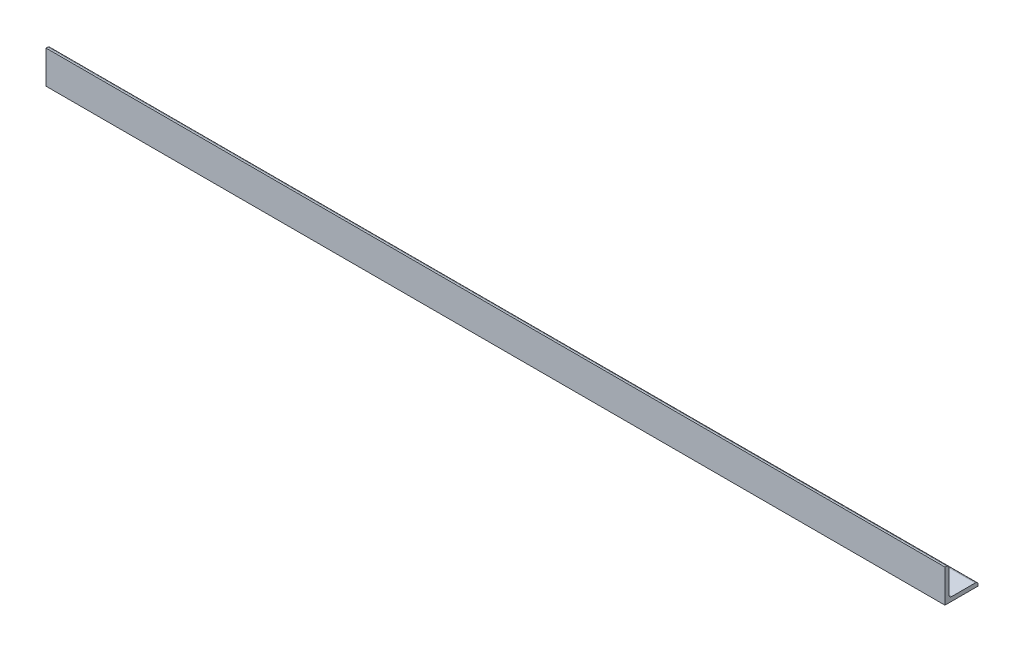
ISO-10303-21;
HEADER;
FILE_DESCRIPTION(('STEP AP214'),'2;1');
FILE_NAME('part.step','',(''),(''),'','','');
FILE_SCHEMA(('AUTOMOTIVE_DESIGN { 1 0 10303 214 1 1 1 1 }'));
ENDSEC;
DATA;
#1=APPLICATION_CONTEXT('core data for automotive mechanical design processes');
#2=APPLICATION_PROTOCOL_DEFINITION('international standard','automotive_design',2000,#1);
#3=PRODUCT_CONTEXT('',#1,'mechanical');
#4=PRODUCT('Part','Part','',(#3));
#5=PRODUCT_RELATED_PRODUCT_CATEGORY('part','',(#4));
#6=PRODUCT_DEFINITION_FORMATION('','',#4);
#7=PRODUCT_DEFINITION_CONTEXT('part definition',#1,'design');
#8=PRODUCT_DEFINITION('design','',#6,#7);
#9=PRODUCT_DEFINITION_SHAPE('','',#8);
#10=(LENGTH_UNIT() NAMED_UNIT(*) SI_UNIT(.MILLI.,.METRE.));
#11=(NAMED_UNIT(*) PLANE_ANGLE_UNIT() SI_UNIT($,.RADIAN.));
#12=(NAMED_UNIT(*) SI_UNIT($,.STERADIAN.) SOLID_ANGLE_UNIT());
#13=UNCERTAINTY_MEASURE_WITH_UNIT(LENGTH_MEASURE(1.E-05),#10,'distance_accuracy_value','');
#14=(GEOMETRIC_REPRESENTATION_CONTEXT(3) GLOBAL_UNCERTAINTY_ASSIGNED_CONTEXT((#13)) GLOBAL_UNIT_ASSIGNED_CONTEXT((#10,
#11,#12)) REPRESENTATION_CONTEXT('',''));
#15=CARTESIAN_POINT('',(0.,0.,0.));
#16=DIRECTION('',(0.,0.,1.));
#17=DIRECTION('',(1.,0.,0.));
#18=AXIS2_PLACEMENT_3D('',#15,#16,#17);
#19=CARTESIAN_POINT('',(-70.4893476114889,-310.689072168843,-671.1));
#20=DIRECTION('',(0.,-1.,0.));
#21=DIRECTION('',(0.,0.,-1.));
#22=AXIS2_PLACEMENT_3D('',#19,#20,#21);
#23=CYLINDRICAL_SURFACE('',#22,3.4);
#24=CARTESIAN_POINT('',(-70.4893476114889,-305.926572168843,-671.1));
#25=DIRECTION('',(0.,-1.,0.));
#26=DIRECTION('',(0.,0.,-1.));
#27=AXIS2_PLACEMENT_3D('',#24,#25,#26);
#28=CIRCLE('',#27,3.4);
#29=CARTESIAN_POINT('',(-70.4893476114889,-305.926572168843,-674.5));
#30=VERTEX_POINT('',#29);
#31=EDGE_CURVE('E19',#30,#30,#28,.F.);
#32=ORIENTED_EDGE('',*,*,#31,.T.);
#33=EDGE_LOOP('',(#32));
#34=FACE_BOUND('',#33,.T.);
#35=CARTESIAN_POINT('',(-70.4893476114889,-310.017902480865,-671.1));
#36=DIRECTION('',(0.,-1.,0.));
#37=DIRECTION('',(-1.,0.,0.));
#38=AXIS2_PLACEMENT_3D('',#35,#36,#37);
#39=CIRCLE('',#38,3.40000000000923);
#40=CARTESIAN_POINT('',(-73.8893476114981,-310.017902480865,-671.1));
#41=VERTEX_POINT('',#40);
#42=EDGE_CURVE('E102',#41,#41,#39,.T.);
#43=ORIENTED_EDGE('',*,*,#42,.T.);
#44=EDGE_LOOP('',(#43));
#45=FACE_BOUND('',#44,.T.);
#46=ADVANCED_FACE('F16',(#34,#45),#23,.F.);
#47=CARTESIAN_POINT('',(-70.4893476114889,-310.689072168771,-671.1));
#48=DIRECTION('',(0.,-1.,0.));
#49=DIRECTION('',(0.,0.,-1.));
#50=AXIS2_PLACEMENT_3D('',#47,#48,#49);
#51=CONICAL_SURFACE('',#50,4.56249999997321,1.04719755120111);
#52=CARTESIAN_POINT('',(-70.4893476114889,-310.689072168765,-671.1));
#53=DIRECTION('',(0.,-1.,0.));
#54=DIRECTION('',(0.,0.,-1.));
#55=AXIS2_PLACEMENT_3D('',#52,#53,#54);
#56=CIRCLE('',#55,4.56249999996317);
#57=CARTESIAN_POINT('',(-70.4893476114889,-310.689072168765,-675.662499999963));
#58=VERTEX_POINT('',#57);
#59=EDGE_CURVE('E184',#58,#58,#56,.T.);
#60=ORIENTED_EDGE('',*,*,#59,.T.);
#61=EDGE_LOOP('',(#60));
#62=FACE_BOUND('',#61,.T.);
#63=ORIENTED_EDGE('',*,*,#42,.F.);
#64=EDGE_LOOP('',(#63));
#65=FACE_BOUND('',#64,.T.);
#66=ADVANCED_FACE('F268',(#62,#65),#51,.F.);
#67=CARTESIAN_POINT('',(551.510652388512,-305.926572168843,-690.15));
#68=DIRECTION('',(0.,0.,1.));
#69=DIRECTION('',(1.,0.,0.));
#70=AXIS2_PLACEMENT_3D('',#67,#68,#69);
#71=PLANE('',#70);
#72=DIRECTION('',(0.,1.,0.));
#73=VECTOR('',#72,1.);
#74=CARTESIAN_POINT('',(-861.589347611489,-310.689072168843,-690.15));
#75=LINE('',#74,#73);
#76=CARTESIAN_POINT('',(-861.589347611489,-308.926572168843,-690.15));
#77=VERTEX_POINT('',#76);
#78=CARTESIAN_POINT('',(-861.589347611489,-310.689072168843,-690.15));
#79=VERTEX_POINT('',#78);
#80=EDGE_CURVE('E171',#77,#79,#75,.F.);
#81=ORIENTED_EDGE('',*,*,#80,.F.);
#82=DIRECTION('',(-1.,0.,0.));
#83=VECTOR('',#82,1.);
#84=CARTESIAN_POINT('',(0.,-308.926572168843,-690.15));
#85=LINE('',#84,#83);
#86=CARTESIAN_POINT('',(174.610652388511,-308.926572168843,-690.15));
#87=VERTEX_POINT('',#86);
#88=EDGE_CURVE('E158',#87,#77,#85,.T.);
#89=ORIENTED_EDGE('',*,*,#88,.F.);
#90=DIRECTION('',(0.,1.,0.));
#91=VECTOR('',#90,1.);
#92=CARTESIAN_POINT('',(174.610652388511,-310.689072168843,-690.15));
#93=LINE('',#92,#91);
#94=CARTESIAN_POINT('',(174.610652388511,-310.689072168843,-690.15));
#95=VERTEX_POINT('',#94);
#96=EDGE_CURVE('E121',#95,#87,#93,.T.);
#97=ORIENTED_EDGE('',*,*,#96,.F.);
#98=DIRECTION('',(1.,0.,0.));
#99=VECTOR('',#98,1.);
#100=CARTESIAN_POINT('',(551.510652388512,-310.689072168843,-690.15));
#101=LINE('',#100,#99);
#102=EDGE_CURVE('E168',#95,#79,#101,.F.);
#103=ORIENTED_EDGE('',*,*,#102,.T.);
#104=EDGE_LOOP('',(#81,#89,#97,#103));
#105=FACE_BOUND('',#104,.T.);
#106=ADVANCED_FACE('F229',(#105),#71,.F.);
#107=CARTESIAN_POINT('',(551.510652388512,-272.589072168843,-656.8125));
#108=DIRECTION('',(0.,0.,1.));
#109=DIRECTION('',(1.,0.,0.));
#110=AXIS2_PLACEMENT_3D('',#107,#108,#109);
#111=PLANE('',#110);
#112=DIRECTION('',(0.,1.,0.));
#113=VECTOR('',#112,1.);
#114=CARTESIAN_POINT('',(174.610652388511,-310.689072168843,-656.8125));
#115=LINE('',#114,#113);
#116=CARTESIAN_POINT('',(174.610652388511,-302.926572168843,-656.8125));
#117=VERTEX_POINT('',#116);
#118=CARTESIAN_POINT('',(174.610652388511,-275.589072168843,-656.8125));
#119=VERTEX_POINT('',#118);
#120=EDGE_CURVE('E106',#117,#119,#115,.T.);
#121=ORIENTED_EDGE('',*,*,#120,.F.);
#122=DIRECTION('',(-1.,0.,0.));
#123=VECTOR('',#122,1.);
#124=CARTESIAN_POINT('',(0.,-302.926572168843,-656.8125));
#125=LINE('',#124,#123);
#126=CARTESIAN_POINT('',(-861.589347611489,-302.926572168843,-656.8125));
#127=VERTEX_POINT('',#126);
#128=EDGE_CURVE('E93',#117,#127,#125,.T.);
#129=ORIENTED_EDGE('',*,*,#128,.T.);
#130=DIRECTION('',(0.,1.,0.));
#131=VECTOR('',#130,1.);
#132=CARTESIAN_POINT('',(-861.589347611489,-310.689072168843,-656.8125));
#133=LINE('',#132,#131);
#134=CARTESIAN_POINT('',(-861.589347611489,-275.589072168843,-656.8125));
#135=VERTEX_POINT('',#134);
#136=EDGE_CURVE('E200',#135,#127,#133,.F.);
#137=ORIENTED_EDGE('',*,*,#136,.F.);
#138=DIRECTION('',(1.,0.,0.));
#139=VECTOR('',#138,1.);
#140=CARTESIAN_POINT('',(0.,-275.589072168843,-656.8125));
#141=LINE('',#140,#139);
#142=EDGE_CURVE('E112',#119,#135,#141,.F.);
#143=ORIENTED_EDGE('',*,*,#142,.F.);
#144=EDGE_LOOP('',(#121,#129,#137,#143));
#145=FACE_BOUND('',#144,.T.);
#146=ADVANCED_FACE('F111',(#145),#111,.F.);
#147=CARTESIAN_POINT('',(0.,-302.926572168843,-659.8125));
#148=DIRECTION('',(-1.,0.,0.));
#149=DIRECTION('',(0.,0.,1.));
#150=AXIS2_PLACEMENT_3D('',#147,#148,#149);
#151=CYLINDRICAL_SURFACE('',#150,3.);
#152=CARTESIAN_POINT('',(-861.589347611489,-302.926572168843,-659.8125));
#153=DIRECTION('',(-1.,0.,0.));
#154=DIRECTION('',(0.,0.,1.));
#155=AXIS2_PLACEMENT_3D('',#152,#153,#154);
#156=CIRCLE('',#155,3.);
#157=CARTESIAN_POINT('',(-861.589347611489,-305.926572168843,-659.8125));
#158=VERTEX_POINT('',#157);
#159=EDGE_CURVE('E97',#127,#158,#156,.F.);
#160=ORIENTED_EDGE('',*,*,#159,.F.);
#161=ORIENTED_EDGE('',*,*,#128,.F.);
#162=CARTESIAN_POINT('',(174.610652388511,-302.926572168843,-659.8125));
#163=DIRECTION('',(-1.,0.,0.));
#164=DIRECTION('',(0.,0.,1.));
#165=AXIS2_PLACEMENT_3D('',#162,#163,#164);
#166=CIRCLE('',#165,3.);
#167=CARTESIAN_POINT('',(174.610652388511,-305.926572168843,-659.8125));
#168=VERTEX_POINT('',#167);
#169=EDGE_CURVE('E96',#168,#117,#166,.T.);
#170=ORIENTED_EDGE('',*,*,#169,.F.);
#171=DIRECTION('',(1.,0.,0.));
#172=VECTOR('',#171,1.);
#173=CARTESIAN_POINT('',(551.510652388512,-305.926572168843,-659.8125));
#174=LINE('',#173,#172);
#175=EDGE_CURVE('E86',#168,#158,#174,.F.);
#176=ORIENTED_EDGE('',*,*,#175,.T.);
#177=EDGE_LOOP('',(#160,#161,#170,#176));
#178=FACE_BOUND('',#177,.T.);
#179=ADVANCED_FACE('F95',(#178),#151,.F.);
#180=CARTESIAN_POINT('',(551.510652388512,-305.926572168843,-656.8125));
#181=DIRECTION('',(0.,-1.,0.));
#182=DIRECTION('',(0.,0.,-1.));
#183=AXIS2_PLACEMENT_3D('',#180,#181,#182);
#184=PLANE('',#183);
#185=ORIENTED_EDGE('',*,*,#31,.F.);
#186=EDGE_LOOP('',(#185));
#187=FACE_BOUND('',#186,.T.);
#188=DIRECTION('',(0.,0.,-1.));
#189=VECTOR('',#188,1.);
#190=CARTESIAN_POINT('',(174.610652388511,-305.926572168843,-270.05));
#191=LINE('',#190,#189);
#192=CARTESIAN_POINT('',(174.610652388511,-305.926572168843,-687.15));
#193=VERTEX_POINT('',#192);
#194=EDGE_CURVE('E109',#193,#168,#191,.F.);
#195=ORIENTED_EDGE('',*,*,#194,.F.);
#196=DIRECTION('',(-1.,0.,0.));
#197=VECTOR('',#196,1.);
#198=CARTESIAN_POINT('',(0.,-305.926572168843,-687.15));
#199=LINE('',#198,#197);
#200=CARTESIAN_POINT('',(-861.589347611489,-305.926572168843,-687.15));
#201=VERTEX_POINT('',#200);
#202=EDGE_CURVE('E161',#201,#193,#199,.F.);
#203=ORIENTED_EDGE('',*,*,#202,.F.);
#204=DIRECTION('',(0.,0.,1.));
#205=VECTOR('',#204,1.);
#206=CARTESIAN_POINT('',(-861.589347611489,-305.926572168843,-793.95));
#207=LINE('',#206,#205);
#208=EDGE_CURVE('E197',#158,#201,#207,.F.);
#209=ORIENTED_EDGE('',*,*,#208,.F.);
#210=ORIENTED_EDGE('',*,*,#175,.F.);
#211=EDGE_LOOP('',(#195,#203,#209,#210));
#212=FACE_BOUND('',#211,.T.);
#213=ADVANCED_FACE('F225',(#187,#212),#184,.F.);
#214=CARTESIAN_POINT('',(0.,-308.926572168843,-687.15));
#215=DIRECTION('',(-1.,0.,0.));
#216=DIRECTION('',(0.,0.,1.));
#217=AXIS2_PLACEMENT_3D('',#214,#215,#216);
#218=CYLINDRICAL_SURFACE('',#217,3.);
#219=ORIENTED_EDGE('',*,*,#88,.T.);
#220=CARTESIAN_POINT('',(-861.589347611489,-308.926572168843,-687.15));
#221=DIRECTION('',(-1.,0.,0.));
#222=DIRECTION('',(0.,0.,1.));
#223=AXIS2_PLACEMENT_3D('',#220,#221,#222);
#224=CIRCLE('',#223,3.);
#225=EDGE_CURVE('E150',#201,#77,#224,.T.);
#226=ORIENTED_EDGE('',*,*,#225,.F.);
#227=ORIENTED_EDGE('',*,*,#202,.T.);
#228=CARTESIAN_POINT('',(174.610652388511,-308.926572168843,-687.15));
#229=DIRECTION('',(-1.,0.,0.));
#230=DIRECTION('',(0.,0.,1.));
#231=AXIS2_PLACEMENT_3D('',#228,#229,#230);
#232=CIRCLE('',#231,3.);
#233=EDGE_CURVE('E207',#87,#193,#232,.F.);
#234=ORIENTED_EDGE('',*,*,#233,.F.);
#235=EDGE_LOOP('',(#219,#226,#227,#234));
#236=FACE_BOUND('',#235,.T.);
#237=ADVANCED_FACE('F227',(#236),#218,.T.);
#238=CARTESIAN_POINT('',(0.,-275.589072168843,-653.8125));
#239=DIRECTION('',(1.,0.,0.));
#240=DIRECTION('',(0.,0.,-1.));
#241=AXIS2_PLACEMENT_3D('',#238,#239,#240);
#242=CYLINDRICAL_SURFACE('',#241,3.);
#243=DIRECTION('',(1.,0.,0.));
#244=VECTOR('',#243,1.);
#245=CARTESIAN_POINT('',(551.510652388512,-272.589072168843,-653.8125));
#246=LINE('',#245,#244);
#247=CARTESIAN_POINT('',(-861.589347611489,-272.589072168843,-653.8125));
#248=VERTEX_POINT('',#247);
#249=CARTESIAN_POINT('',(174.610652388511,-272.589072168843,-653.8125));
#250=VERTEX_POINT('',#249);
#251=EDGE_CURVE('E129',#248,#250,#246,.T.);
#252=ORIENTED_EDGE('',*,*,#251,.T.);
#253=CARTESIAN_POINT('',(174.610652388511,-275.589072168843,-653.8125));
#254=DIRECTION('',(1.,0.,0.));
#255=DIRECTION('',(0.,0.,-1.));
#256=AXIS2_PLACEMENT_3D('',#253,#254,#255);
#257=CIRCLE('',#256,3.);
#258=EDGE_CURVE('E115',#119,#250,#257,.T.);
#259=ORIENTED_EDGE('',*,*,#258,.F.);
#260=ORIENTED_EDGE('',*,*,#142,.T.);
#261=CARTESIAN_POINT('',(-861.589347611489,-275.589072168843,-653.8125));
#262=DIRECTION('',(1.,0.,0.));
#263=DIRECTION('',(0.,0.,-1.));
#264=AXIS2_PLACEMENT_3D('',#261,#262,#263);
#265=CIRCLE('',#264,3.);
#266=EDGE_CURVE('E178',#248,#135,#265,.F.);
#267=ORIENTED_EDGE('',*,*,#266,.F.);
#268=EDGE_LOOP('',(#252,#259,#260,#267));
#269=FACE_BOUND('',#268,.T.);
#270=ADVANCED_FACE('F254',(#269),#242,.T.);
#271=CARTESIAN_POINT('',(174.610652388511,-310.689072168843,-270.05));
#272=DIRECTION('',(1.,0.,0.));
#273=DIRECTION('',(0.,0.,-1.));
#274=AXIS2_PLACEMENT_3D('',#271,#272,#273);
#275=PLANE('',#274);
#276=ORIENTED_EDGE('',*,*,#96,.T.);
#277=ORIENTED_EDGE('',*,*,#233,.T.);
#278=ORIENTED_EDGE('',*,*,#194,.T.);
#279=ORIENTED_EDGE('',*,*,#169,.T.);
#280=ORIENTED_EDGE('',*,*,#120,.T.);
#281=ORIENTED_EDGE('',*,*,#258,.T.);
#282=DIRECTION('',(0.,0.,-1.));
#283=VECTOR('',#282,1.);
#284=CARTESIAN_POINT('',(174.610652388511,-272.589072168843,-652.05));
#285=LINE('',#284,#283);
#286=CARTESIAN_POINT('',(174.610652388511,-272.589072168843,-652.05));
#287=VERTEX_POINT('',#286);
#288=EDGE_CURVE('E136',#250,#287,#285,.F.);
#289=ORIENTED_EDGE('',*,*,#288,.T.);
#290=DIRECTION('',(0.,1.,0.));
#291=VECTOR('',#290,1.);
#292=CARTESIAN_POINT('',(174.610652388511,-310.689072168843,-652.05));
#293=LINE('',#292,#291);
#294=CARTESIAN_POINT('',(174.610652388511,-310.689072168843,-652.05));
#295=VERTEX_POINT('',#294);
#296=EDGE_CURVE('E133',#287,#295,#293,.F.);
#297=ORIENTED_EDGE('',*,*,#296,.T.);
#298=DIRECTION('',(0.,0.,1.));
#299=VECTOR('',#298,1.);
#300=CARTESIAN_POINT('',(174.610652388511,-310.689072168843,-690.15));
#301=LINE('',#300,#299);
#302=EDGE_CURVE('E172',#295,#95,#301,.F.);
#303=ORIENTED_EDGE('',*,*,#302,.T.);
#304=EDGE_LOOP('',(#276,#277,#278,#279,#280,#281,#289,#297,#303));
#305=FACE_BOUND('',#304,.T.);
#306=ADVANCED_FACE('F105',(#305),#275,.T.);
#307=CARTESIAN_POINT('',(551.510652388512,-310.689072168843,-690.15));
#308=DIRECTION('',(0.,1.,0.));
#309=DIRECTION('',(0.,0.,1.));
#310=AXIS2_PLACEMENT_3D('',#307,#308,#309);
#311=PLANE('',#310);
#312=DIRECTION('',(0.,0.,1.));
#313=VECTOR('',#312,1.);
#314=CARTESIAN_POINT('',(-861.589347611489,-310.689072168843,-793.95));
#315=LINE('',#314,#313);
#316=CARTESIAN_POINT('',(-861.589347611489,-310.689072168843,-652.05));
#317=VERTEX_POINT('',#316);
#318=EDGE_CURVE('E175',#79,#317,#315,.T.);
#319=ORIENTED_EDGE('',*,*,#318,.F.);
#320=ORIENTED_EDGE('',*,*,#102,.F.);
#321=ORIENTED_EDGE('',*,*,#302,.F.);
#322=DIRECTION('',(-1.,0.,0.));
#323=VECTOR('',#322,1.);
#324=CARTESIAN_POINT('',(551.510652388512,-310.689072168843,-652.05));
#325=LINE('',#324,#323);
#326=EDGE_CURVE('E144',#295,#317,#325,.T.);
#327=ORIENTED_EDGE('',*,*,#326,.T.);
#328=EDGE_LOOP('',(#319,#320,#321,#327));
#329=FACE_BOUND('',#328,.T.);
#330=ORIENTED_EDGE('',*,*,#59,.F.);
#331=EDGE_LOOP('',(#330));
#332=FACE_BOUND('',#331,.T.);
#333=ADVANCED_FACE('F237',(#329,#332),#311,.F.);
#334=CARTESIAN_POINT('',(-861.589347611489,-310.689072168843,-793.95));
#335=DIRECTION('',(-1.,0.,0.));
#336=DIRECTION('',(0.,0.,1.));
#337=AXIS2_PLACEMENT_3D('',#334,#335,#336);
#338=PLANE('',#337);
#339=ORIENTED_EDGE('',*,*,#208,.T.);
#340=ORIENTED_EDGE('',*,*,#225,.T.);
#341=ORIENTED_EDGE('',*,*,#80,.T.);
#342=ORIENTED_EDGE('',*,*,#318,.T.);
#343=DIRECTION('',(0.,1.,0.));
#344=VECTOR('',#343,1.);
#345=CARTESIAN_POINT('',(-861.589347611489,-310.689072168843,-652.05));
#346=LINE('',#345,#344);
#347=CARTESIAN_POINT('',(-861.589347611489,-272.589072168843,-652.05));
#348=VERTEX_POINT('',#347);
#349=EDGE_CURVE('E26',#317,#348,#346,.T.);
#350=ORIENTED_EDGE('',*,*,#349,.T.);
#351=DIRECTION('',(0.,0.,-1.));
#352=VECTOR('',#351,1.);
#353=CARTESIAN_POINT('',(-861.589347611489,-272.589072168843,-652.05));
#354=LINE('',#353,#352);
#355=EDGE_CURVE('E34',#348,#248,#354,.T.);
#356=ORIENTED_EDGE('',*,*,#355,.T.);
#357=ORIENTED_EDGE('',*,*,#266,.T.);
#358=ORIENTED_EDGE('',*,*,#136,.T.);
#359=ORIENTED_EDGE('',*,*,#159,.T.);
#360=EDGE_LOOP('',(#339,#340,#341,#342,#350,#356,#357,#358,#359));
#361=FACE_BOUND('',#360,.T.);
#362=ADVANCED_FACE('F222',(#361),#338,.T.);
#363=CARTESIAN_POINT('',(551.510652388512,-272.589072168843,-652.05));
#364=DIRECTION('',(0.,-1.,0.));
#365=DIRECTION('',(0.,0.,-1.));
#366=AXIS2_PLACEMENT_3D('',#363,#364,#365);
#367=PLANE('',#366);
#368=ORIENTED_EDGE('',*,*,#355,.F.);
#369=DIRECTION('',(-1.,0.,0.));
#370=VECTOR('',#369,1.);
#371=CARTESIAN_POINT('',(551.510652388512,-272.589072168843,-652.05));
#372=LINE('',#371,#370);
#373=EDGE_CURVE('E11',#348,#287,#372,.F.);
#374=ORIENTED_EDGE('',*,*,#373,.T.);
#375=ORIENTED_EDGE('',*,*,#288,.F.);
#376=ORIENTED_EDGE('',*,*,#251,.F.);
#377=EDGE_LOOP('',(#368,#374,#375,#376));
#378=FACE_BOUND('',#377,.T.);
#379=ADVANCED_FACE('F240',(#378),#367,.F.);
#380=CARTESIAN_POINT('',(551.510652388512,-310.689072168843,-652.05));
#381=DIRECTION('',(0.,0.,-1.));
#382=DIRECTION('',(-1.,0.,0.));
#383=AXIS2_PLACEMENT_3D('',#380,#381,#382);
#384=PLANE('',#383);
#385=ORIENTED_EDGE('',*,*,#349,.F.);
#386=ORIENTED_EDGE('',*,*,#326,.F.);
#387=ORIENTED_EDGE('',*,*,#296,.F.);
#388=ORIENTED_EDGE('',*,*,#373,.F.);
#389=EDGE_LOOP('',(#385,#386,#387,#388));
#390=FACE_BOUND('',#389,.T.);
#391=ADVANCED_FACE('F236',(#390),#384,.F.);
#392=CLOSED_SHELL('',(#46,#66,#106,#146,#179,#213,#237,#270,#306,#333,#362,#379,#391));
#393=MANIFOLD_SOLID_BREP('B1',#392);
#394=ADVANCED_BREP_SHAPE_REPRESENTATION('',(#18,#393),#14);
#395=SHAPE_DEFINITION_REPRESENTATION(#9,#394);
ENDSEC;
END-ISO-10303-21;
